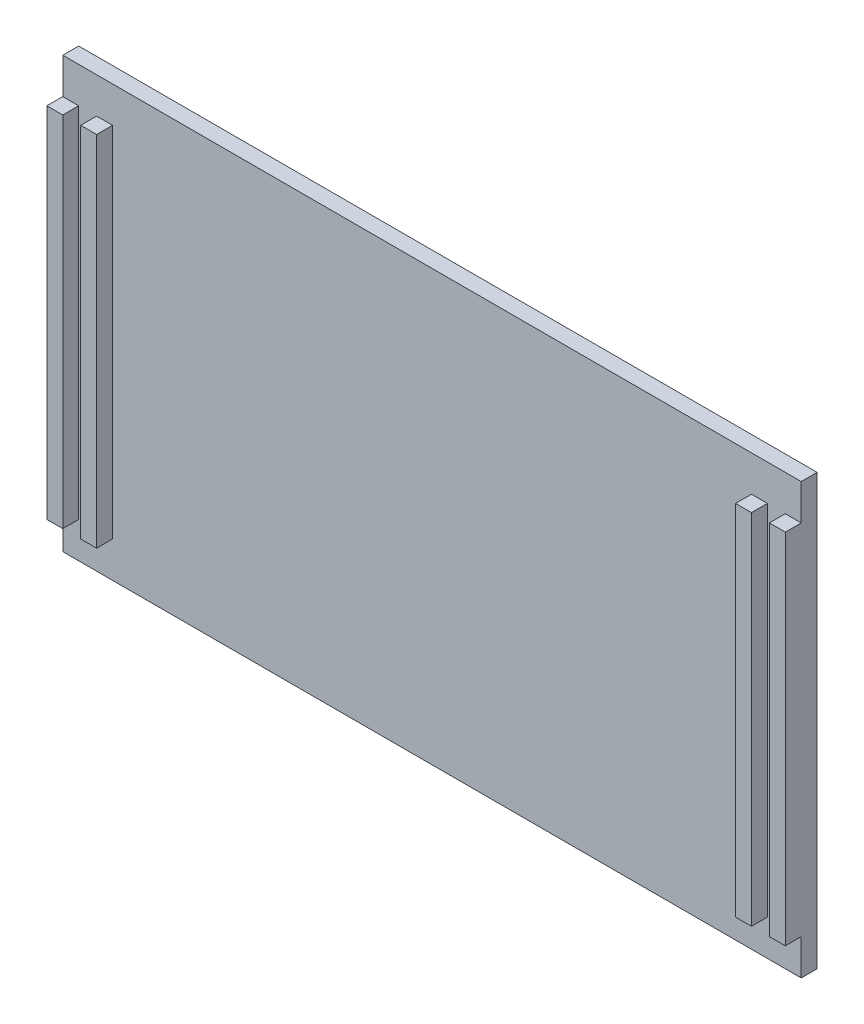
ISO-10303-21;
HEADER;
FILE_DESCRIPTION(('STEP AP214'),'2;1');
FILE_NAME('part.step','',(''),(''),'','','');
FILE_SCHEMA(('AUTOMOTIVE_DESIGN { 1 0 10303 214 1 1 1 1 }'));
ENDSEC;
DATA;
#1=APPLICATION_CONTEXT('core data for automotive mechanical design processes');
#2=APPLICATION_PROTOCOL_DEFINITION('international standard','automotive_design',2000,#1);
#3=PRODUCT_CONTEXT('',#1,'mechanical');
#4=PRODUCT('Part','Part','',(#3));
#5=PRODUCT_RELATED_PRODUCT_CATEGORY('part','',(#4));
#6=PRODUCT_DEFINITION_FORMATION('','',#4);
#7=PRODUCT_DEFINITION_CONTEXT('part definition',#1,'design');
#8=PRODUCT_DEFINITION('design','',#6,#7);
#9=PRODUCT_DEFINITION_SHAPE('','',#8);
#10=(LENGTH_UNIT() NAMED_UNIT(*) SI_UNIT(.MILLI.,.METRE.));
#11=(NAMED_UNIT(*) PLANE_ANGLE_UNIT() SI_UNIT($,.RADIAN.));
#12=(NAMED_UNIT(*) SI_UNIT($,.STERADIAN.) SOLID_ANGLE_UNIT());
#13=UNCERTAINTY_MEASURE_WITH_UNIT(LENGTH_MEASURE(1.E-05),#10,'distance_accuracy_value','');
#14=(GEOMETRIC_REPRESENTATION_CONTEXT(3) GLOBAL_UNCERTAINTY_ASSIGNED_CONTEXT((#13)) GLOBAL_UNIT_ASSIGNED_CONTEXT((#10,
#11,#12)) REPRESENTATION_CONTEXT('',''));
#15=CARTESIAN_POINT('',(0.,0.,0.));
#16=DIRECTION('',(0.,0.,1.));
#17=DIRECTION('',(1.,0.,0.));
#18=AXIS2_PLACEMENT_3D('',#15,#16,#17);
#19=CARTESIAN_POINT('',(-63.4088927024772,54.,-20.4879937354561));
#20=DIRECTION('',(1.,0.,0.));
#21=DIRECTION('',(0.,0.,-1.));
#22=AXIS2_PLACEMENT_3D('',#19,#20,#21);
#23=PLANE('',#22);
#24=DIRECTION('',(0.,0.,1.));
#25=VECTOR('',#24,1.);
#26=CARTESIAN_POINT('',(-63.4088927024772,-54.,-20.4879937354561));
#27=LINE('',#26,#25);
#28=CARTESIAN_POINT('',(-63.4088927024772,-54.,-20.4879937354561));
#29=VERTEX_POINT('',#28);
#30=CARTESIAN_POINT('',(-63.4088927024772,-54.,-16.4879937354562));
#31=VERTEX_POINT('',#30);
#32=EDGE_CURVE('E195',#29,#31,#27,.T.);
#33=ORIENTED_EDGE('',*,*,#32,.T.);
#34=DIRECTION('',(0.,-1.,0.));
#35=VECTOR('',#34,1.);
#36=CARTESIAN_POINT('',(-63.4088927024773,-54.,-16.4879937354561));
#37=LINE('',#36,#35);
#38=CARTESIAN_POINT('',(-63.4088927024773,-45.,-16.4879937354562));
#39=VERTEX_POINT('',#38);
#40=EDGE_CURVE('E175',#39,#31,#37,.T.);
#41=ORIENTED_EDGE('',*,*,#40,.F.);
#42=DIRECTION('',(0.,0.,1.));
#43=VECTOR('',#42,1.);
#44=CARTESIAN_POINT('',(-63.4088927024773,-45.,-202.206194243645));
#45=LINE('',#44,#43);
#46=CARTESIAN_POINT('',(-63.4088927024773,-45.,-12.4879937354561));
#47=VERTEX_POINT('',#46);
#48=EDGE_CURVE('E187',#39,#47,#45,.T.);
#49=ORIENTED_EDGE('',*,*,#48,.T.);
#50=DIRECTION('',(0.,-1.,0.));
#51=VECTOR('',#50,1.);
#52=CARTESIAN_POINT('',(-63.4088927024772,54.,-12.4879937354561));
#53=LINE('',#52,#51);
#54=CARTESIAN_POINT('',(-63.4088927024773,45.,-12.4879937354561));
#55=VERTEX_POINT('',#54);
#56=EDGE_CURVE('E11',#55,#47,#53,.T.);
#57=ORIENTED_EDGE('',*,*,#56,.F.);
#58=DIRECTION('',(0.,0.,1.));
#59=VECTOR('',#58,1.);
#60=CARTESIAN_POINT('',(-63.4088927024773,45.,-202.206194243645));
#61=LINE('',#60,#59);
#62=CARTESIAN_POINT('',(-63.4088927024773,45.,-16.4879937354561));
#63=VERTEX_POINT('',#62);
#64=EDGE_CURVE('E235',#63,#55,#61,.T.);
#65=ORIENTED_EDGE('',*,*,#64,.F.);
#66=DIRECTION('',(0.,-1.,0.));
#67=VECTOR('',#66,1.);
#68=CARTESIAN_POINT('',(-63.4088927024773,54.,-16.4879937354561));
#69=LINE('',#68,#67);
#70=CARTESIAN_POINT('',(-63.4088927024773,54.,-16.4879937354562));
#71=VERTEX_POINT('',#70);
#72=EDGE_CURVE('E223',#71,#63,#69,.T.);
#73=ORIENTED_EDGE('',*,*,#72,.F.);
#74=DIRECTION('',(0.,0.,1.));
#75=VECTOR('',#74,1.);
#76=CARTESIAN_POINT('',(-63.4088927024772,54.,-20.4879937354561));
#77=LINE('',#76,#75);
#78=CARTESIAN_POINT('',(-63.4088927024772,54.,-20.4879937354561));
#79=VERTEX_POINT('',#78);
#80=EDGE_CURVE('E256',#79,#71,#77,.T.);
#81=ORIENTED_EDGE('',*,*,#80,.F.);
#82=DIRECTION('',(0.,-1.,0.));
#83=VECTOR('',#82,1.);
#84=CARTESIAN_POINT('',(-63.4088927024772,54.,-20.4879937354561));
#85=LINE('',#84,#83);
#86=EDGE_CURVE('E264',#79,#29,#85,.T.);
#87=ORIENTED_EDGE('',*,*,#86,.T.);
#88=EDGE_LOOP('',(#33,#41,#49,#57,#65,#73,#81,#87));
#89=FACE_BOUND('',#88,.T.);
#90=ADVANCED_FACE('F35',(#89),#23,.F.);
#91=CARTESIAN_POINT('',(-63.4088927024772,54.,-12.4879937354561));
#92=DIRECTION('',(0.,0.,-1.));
#93=DIRECTION('',(-1.,0.,0.));
#94=AXIS2_PLACEMENT_3D('',#91,#92,#93);
#95=PLANE('',#94);
#96=ORIENTED_EDGE('',*,*,#56,.T.);
#97=DIRECTION('',(-1.,0.,0.));
#98=VECTOR('',#97,1.);
#99=CARTESIAN_POINT('',(122.091107297523,-45.,-12.4879937354561));
#100=LINE('',#99,#98);
#101=CARTESIAN_POINT('',(-59.4088927024772,-45.,-12.4879937354561));
#102=VERTEX_POINT('',#101);
#103=EDGE_CURVE('E190',#102,#47,#100,.T.);
#104=ORIENTED_EDGE('',*,*,#103,.F.);
#105=DIRECTION('',(0.,-1.,0.));
#106=VECTOR('',#105,1.);
#107=CARTESIAN_POINT('',(-59.4088927024772,54.,-12.4879937354561));
#108=LINE('',#107,#106);
#109=CARTESIAN_POINT('',(-59.4088927024772,45.,-12.4879937354561));
#110=VERTEX_POINT('',#109);
#111=EDGE_CURVE('E42',#110,#102,#108,.T.);
#112=ORIENTED_EDGE('',*,*,#111,.F.);
#113=DIRECTION('',(1.,0.,0.));
#114=VECTOR('',#113,1.);
#115=CARTESIAN_POINT('',(122.091107297523,45.,-12.4879937354561));
#116=LINE('',#115,#114);
#117=EDGE_CURVE('E221',#55,#110,#116,.T.);
#118=ORIENTED_EDGE('',*,*,#117,.F.);
#119=EDGE_LOOP('',(#96,#104,#112,#118));
#120=FACE_BOUND('',#119,.T.);
#121=ADVANCED_FACE('F313',(#120),#95,.F.);
#122=CARTESIAN_POINT('',(-59.4088927024772,54.,-12.4879937354561));
#123=DIRECTION('',(-1.,0.,0.));
#124=DIRECTION('',(0.,0.,1.));
#125=AXIS2_PLACEMENT_3D('',#122,#123,#124);
#126=PLANE('',#125);
#127=ORIENTED_EDGE('',*,*,#111,.T.);
#128=DIRECTION('',(0.,0.,-1.));
#129=VECTOR('',#128,1.);
#130=CARTESIAN_POINT('',(-59.4088927024772,-45.,-12.4879937354561));
#131=LINE('',#130,#129);
#132=CARTESIAN_POINT('',(-59.4088927024772,-45.,-16.4879937354561));
#133=VERTEX_POINT('',#132);
#134=EDGE_CURVE('E218',#102,#133,#131,.T.);
#135=ORIENTED_EDGE('',*,*,#134,.T.);
#136=DIRECTION('',(0.,-1.,0.));
#137=VECTOR('',#136,1.);
#138=CARTESIAN_POINT('',(-59.4088927024772,54.,-16.4879937354561));
#139=LINE('',#138,#137);
#140=CARTESIAN_POINT('',(-59.4088927024772,45.,-16.4879937354561));
#141=VERTEX_POINT('',#140);
#142=EDGE_CURVE('E179',#141,#133,#139,.T.);
#143=ORIENTED_EDGE('',*,*,#142,.F.);
#144=DIRECTION('',(0.,0.,1.));
#145=VECTOR('',#144,1.);
#146=CARTESIAN_POINT('',(-59.4088927024772,45.,-12.4879937354561));
#147=LINE('',#146,#145);
#148=EDGE_CURVE('E253',#141,#110,#147,.T.);
#149=ORIENTED_EDGE('',*,*,#148,.T.);
#150=EDGE_LOOP('',(#127,#135,#143,#149));
#151=FACE_BOUND('',#150,.T.);
#152=ADVANCED_FACE('F310',(#151),#126,.F.);
#153=CARTESIAN_POINT('',(-54.9088927024772,54.,-16.4879937354561));
#154=DIRECTION('',(1.,0.,0.));
#155=DIRECTION('',(0.,0.,-1.));
#156=AXIS2_PLACEMENT_3D('',#153,#154,#155);
#157=PLANE('',#156);
#158=DIRECTION('',(0.,-1.,0.));
#159=VECTOR('',#158,1.);
#160=CARTESIAN_POINT('',(-54.9088927024772,54.,-16.4879937354561));
#161=LINE('',#160,#159);
#162=CARTESIAN_POINT('',(-54.9088927024772,45.,-16.4879937354561));
#163=VERTEX_POINT('',#162);
#164=CARTESIAN_POINT('',(-54.9088927024772,-45.,-16.4879937354561));
#165=VERTEX_POINT('',#164);
#166=EDGE_CURVE('E304',#163,#165,#161,.T.);
#167=ORIENTED_EDGE('',*,*,#166,.T.);
#168=DIRECTION('',(0.,0.,1.));
#169=VECTOR('',#168,1.);
#170=CARTESIAN_POINT('',(-54.9088927024772,-45.,-16.4879937354561));
#171=LINE('',#170,#169);
#172=CARTESIAN_POINT('',(-54.9088927024772,-45.,-12.4879937354561));
#173=VERTEX_POINT('',#172);
#174=EDGE_CURVE('E215',#165,#173,#171,.T.);
#175=ORIENTED_EDGE('',*,*,#174,.T.);
#176=DIRECTION('',(0.,-1.,0.));
#177=VECTOR('',#176,1.);
#178=CARTESIAN_POINT('',(-54.9088927024772,54.,-12.4879937354561));
#179=LINE('',#178,#177);
#180=CARTESIAN_POINT('',(-54.9088927024772,45.,-12.4879937354561));
#181=VERTEX_POINT('',#180);
#182=EDGE_CURVE('E301',#181,#173,#179,.T.);
#183=ORIENTED_EDGE('',*,*,#182,.F.);
#184=DIRECTION('',(0.,0.,-1.));
#185=VECTOR('',#184,1.);
#186=CARTESIAN_POINT('',(-54.9088927024772,45.,-16.4879937354561));
#187=LINE('',#186,#185);
#188=EDGE_CURVE('E250',#181,#163,#187,.T.);
#189=ORIENTED_EDGE('',*,*,#188,.T.);
#190=EDGE_LOOP('',(#167,#175,#183,#189));
#191=FACE_BOUND('',#190,.T.);
#192=ADVANCED_FACE('F361',(#191),#157,.F.);
#193=CARTESIAN_POINT('',(-54.9088927024772,54.,-12.4879937354561));
#194=DIRECTION('',(0.,0.,-1.));
#195=DIRECTION('',(-1.,0.,0.));
#196=AXIS2_PLACEMENT_3D('',#193,#194,#195);
#197=PLANE('',#196);
#198=ORIENTED_EDGE('',*,*,#182,.T.);
#199=CARTESIAN_POINT('',(-50.9088927024772,-45.,-12.4879937354561));
#200=VERTEX_POINT('',#199);
#201=EDGE_CURVE('E314',#200,#173,#100,.T.);
#202=ORIENTED_EDGE('',*,*,#201,.F.);
#203=DIRECTION('',(0.,-1.,0.));
#204=VECTOR('',#203,1.);
#205=CARTESIAN_POINT('',(-50.9088927024772,54.,-12.4879937354561));
#206=LINE('',#205,#204);
#207=CARTESIAN_POINT('',(-50.9088927024772,45.,-12.4879937354561));
#208=VERTEX_POINT('',#207);
#209=EDGE_CURVE('E298',#208,#200,#206,.T.);
#210=ORIENTED_EDGE('',*,*,#209,.F.);
#211=EDGE_CURVE('E224',#181,#208,#116,.T.);
#212=ORIENTED_EDGE('',*,*,#211,.F.);
#213=EDGE_LOOP('',(#198,#202,#210,#212));
#214=FACE_BOUND('',#213,.T.);
#215=ADVANCED_FACE('F368',(#214),#197,.F.);
#216=CARTESIAN_POINT('',(-50.9088927024772,54.,-12.4879937354561));
#217=DIRECTION('',(-1.,0.,0.));
#218=DIRECTION('',(0.,0.,1.));
#219=AXIS2_PLACEMENT_3D('',#216,#217,#218);
#220=PLANE('',#219);
#221=ORIENTED_EDGE('',*,*,#209,.T.);
#222=DIRECTION('',(0.,0.,-1.));
#223=VECTOR('',#222,1.);
#224=CARTESIAN_POINT('',(-50.9088927024772,-45.,-12.4879937354561));
#225=LINE('',#224,#223);
#226=CARTESIAN_POINT('',(-50.9088927024772,-45.,-16.4879937354561));
#227=VERTEX_POINT('',#226);
#228=EDGE_CURVE('E212',#200,#227,#225,.T.);
#229=ORIENTED_EDGE('',*,*,#228,.T.);
#230=DIRECTION('',(0.,-1.,0.));
#231=VECTOR('',#230,1.);
#232=CARTESIAN_POINT('',(-50.9088927024772,54.,-16.4879937354561));
#233=LINE('',#232,#231);
#234=CARTESIAN_POINT('',(-50.9088927024772,45.,-16.4879937354561));
#235=VERTEX_POINT('',#234);
#236=EDGE_CURVE('E295',#235,#227,#233,.T.);
#237=ORIENTED_EDGE('',*,*,#236,.F.);
#238=DIRECTION('',(0.,0.,1.));
#239=VECTOR('',#238,1.);
#240=CARTESIAN_POINT('',(-50.9088927024772,45.,-12.4879937354561));
#241=LINE('',#240,#239);
#242=EDGE_CURVE('E247',#235,#208,#241,.T.);
#243=ORIENTED_EDGE('',*,*,#242,.T.);
#244=EDGE_LOOP('',(#221,#229,#237,#243));
#245=FACE_BOUND('',#244,.T.);
#246=ADVANCED_FACE('F371',(#245),#220,.F.);
#247=CARTESIAN_POINT('',(109.591107297523,54.,-12.4879937354561));
#248=DIRECTION('',(1.,0.,0.));
#249=DIRECTION('',(0.,0.,-1.));
#250=AXIS2_PLACEMENT_3D('',#247,#248,#249);
#251=PLANE('',#250);
#252=DIRECTION('',(0.,-1.,0.));
#253=VECTOR('',#252,1.);
#254=CARTESIAN_POINT('',(109.591107297523,54.,-16.4879937354561));
#255=LINE('',#254,#253);
#256=CARTESIAN_POINT('',(109.591107297523,45.,-16.4879937354561));
#257=VERTEX_POINT('',#256);
#258=CARTESIAN_POINT('',(109.591107297523,-45.,-16.4879937354561));
#259=VERTEX_POINT('',#258);
#260=EDGE_CURVE('E292',#257,#259,#255,.T.);
#261=ORIENTED_EDGE('',*,*,#260,.T.);
#262=DIRECTION('',(0.,0.,1.));
#263=VECTOR('',#262,1.);
#264=CARTESIAN_POINT('',(109.591107297523,-45.,-12.4879937354561));
#265=LINE('',#264,#263);
#266=CARTESIAN_POINT('',(109.591107297523,-45.,-12.4879937354561));
#267=VERTEX_POINT('',#266);
#268=EDGE_CURVE('E209',#259,#267,#265,.T.);
#269=ORIENTED_EDGE('',*,*,#268,.T.);
#270=DIRECTION('',(0.,-1.,0.));
#271=VECTOR('',#270,1.);
#272=CARTESIAN_POINT('',(109.591107297523,54.,-12.4879937354561));
#273=LINE('',#272,#271);
#274=CARTESIAN_POINT('',(109.591107297523,45.,-12.4879937354561));
#275=VERTEX_POINT('',#274);
#276=EDGE_CURVE('E289',#275,#267,#273,.T.);
#277=ORIENTED_EDGE('',*,*,#276,.F.);
#278=DIRECTION('',(0.,0.,-1.));
#279=VECTOR('',#278,1.);
#280=CARTESIAN_POINT('',(109.591107297523,45.,-12.4879937354561));
#281=LINE('',#280,#279);
#282=EDGE_CURVE('E244',#275,#257,#281,.T.);
#283=ORIENTED_EDGE('',*,*,#282,.T.);
#284=EDGE_LOOP('',(#261,#269,#277,#283));
#285=FACE_BOUND('',#284,.T.);
#286=ADVANCED_FACE('F327',(#285),#251,.F.);
#287=CARTESIAN_POINT('',(113.591107297523,54.,-12.4879937354561));
#288=DIRECTION('',(0.,0.,-1.));
#289=DIRECTION('',(-1.,0.,0.));
#290=AXIS2_PLACEMENT_3D('',#287,#288,#289);
#291=PLANE('',#290);
#292=ORIENTED_EDGE('',*,*,#276,.T.);
#293=CARTESIAN_POINT('',(113.591107297523,-45.,-12.4879937354561));
#294=VERTEX_POINT('',#293);
#295=EDGE_CURVE('E316',#294,#267,#100,.T.);
#296=ORIENTED_EDGE('',*,*,#295,.F.);
#297=DIRECTION('',(0.,-1.,0.));
#298=VECTOR('',#297,1.);
#299=CARTESIAN_POINT('',(113.591107297523,54.,-12.4879937354561));
#300=LINE('',#299,#298);
#301=CARTESIAN_POINT('',(113.591107297523,45.,-12.4879937354561));
#302=VERTEX_POINT('',#301);
#303=EDGE_CURVE('E286',#302,#294,#300,.T.);
#304=ORIENTED_EDGE('',*,*,#303,.F.);
#305=EDGE_CURVE('E331',#275,#302,#116,.T.);
#306=ORIENTED_EDGE('',*,*,#305,.F.);
#307=EDGE_LOOP('',(#292,#296,#304,#306));
#308=FACE_BOUND('',#307,.T.);
#309=ADVANCED_FACE('F330',(#308),#291,.F.);
#310=CARTESIAN_POINT('',(113.591107297523,54.,-16.4879937354561));
#311=DIRECTION('',(-1.,0.,0.));
#312=DIRECTION('',(0.,0.,1.));
#313=AXIS2_PLACEMENT_3D('',#310,#311,#312);
#314=PLANE('',#313);
#315=ORIENTED_EDGE('',*,*,#303,.T.);
#316=DIRECTION('',(0.,0.,-1.));
#317=VECTOR('',#316,1.);
#318=CARTESIAN_POINT('',(113.591107297523,-45.,-16.4879937354561));
#319=LINE('',#318,#317);
#320=CARTESIAN_POINT('',(113.591107297523,-45.,-16.4879937354561));
#321=VERTEX_POINT('',#320);
#322=EDGE_CURVE('E206',#294,#321,#319,.T.);
#323=ORIENTED_EDGE('',*,*,#322,.T.);
#324=DIRECTION('',(0.,-1.,0.));
#325=VECTOR('',#324,1.);
#326=CARTESIAN_POINT('',(113.591107297523,54.,-16.4879937354561));
#327=LINE('',#326,#325);
#328=CARTESIAN_POINT('',(113.591107297523,45.,-16.4879937354561));
#329=VERTEX_POINT('',#328);
#330=EDGE_CURVE('E283',#329,#321,#327,.T.);
#331=ORIENTED_EDGE('',*,*,#330,.F.);
#332=DIRECTION('',(0.,0.,1.));
#333=VECTOR('',#332,1.);
#334=CARTESIAN_POINT('',(113.591107297523,45.,-16.4879937354561));
#335=LINE('',#334,#333);
#336=EDGE_CURVE('E241',#329,#302,#335,.T.);
#337=ORIENTED_EDGE('',*,*,#336,.T.);
#338=EDGE_LOOP('',(#315,#323,#331,#337));
#339=FACE_BOUND('',#338,.T.);
#340=ADVANCED_FACE('F418',(#339),#314,.F.);
#341=CARTESIAN_POINT('',(118.091107297523,54.,-16.4879937354561));
#342=DIRECTION('',(0.,0.,-1.));
#343=DIRECTION('',(-1.,0.,0.));
#344=AXIS2_PLACEMENT_3D('',#341,#342,#343);
#345=PLANE('',#344);
#346=DIRECTION('',(-1.,0.,0.));
#347=VECTOR('',#346,1.);
#348=CARTESIAN_POINT('',(122.091107297523,-45.,-16.4879937354561));
#349=LINE('',#348,#347);
#350=EDGE_CURVE('E182',#227,#165,#349,.T.);
#351=ORIENTED_EDGE('',*,*,#350,.T.);
#352=ORIENTED_EDGE('',*,*,#166,.F.);
#353=DIRECTION('',(1.,0.,0.));
#354=VECTOR('',#353,1.);
#355=CARTESIAN_POINT('',(122.091107297523,45.,-16.4879937354561));
#356=LINE('',#355,#354);
#357=EDGE_CURVE('E231',#163,#235,#356,.T.);
#358=ORIENTED_EDGE('',*,*,#357,.T.);
#359=ORIENTED_EDGE('',*,*,#236,.T.);
#360=EDGE_LOOP('',(#351,#352,#358,#359));
#361=FACE_BOUND('',#360,.T.);
#362=EDGE_CURVE('E352',#321,#259,#349,.T.);
#363=ORIENTED_EDGE('',*,*,#362,.T.);
#364=ORIENTED_EDGE('',*,*,#260,.F.);
#365=EDGE_CURVE('E372',#257,#329,#356,.T.);
#366=ORIENTED_EDGE('',*,*,#365,.T.);
#367=ORIENTED_EDGE('',*,*,#330,.T.);
#368=EDGE_LOOP('',(#363,#364,#366,#367));
#369=FACE_BOUND('',#368,.T.);
#370=ORIENTED_EDGE('',*,*,#142,.T.);
#371=EDGE_CURVE('E171',#133,#39,#349,.T.);
#372=ORIENTED_EDGE('',*,*,#371,.T.);
#373=ORIENTED_EDGE('',*,*,#40,.T.);
#374=DIRECTION('',(1.,0.,0.));
#375=VECTOR('',#374,1.);
#376=CARTESIAN_POINT('',(118.091107297523,-54.,-16.4879937354561));
#377=LINE('',#376,#375);
#378=CARTESIAN_POINT('',(122.091107297523,-54.,-16.4879937354561));
#379=VERTEX_POINT('',#378);
#380=EDGE_CURVE('E49',#31,#379,#377,.T.);
#381=ORIENTED_EDGE('',*,*,#380,.T.);
#382=DIRECTION('',(0.,1.,0.));
#383=VECTOR('',#382,1.);
#384=CARTESIAN_POINT('',(122.091107297523,-54.,-16.4879937354561));
#385=LINE('',#384,#383);
#386=CARTESIAN_POINT('',(122.091107297523,-45.,-16.4879937354561));
#387=VERTEX_POINT('',#386);
#388=EDGE_CURVE('E196',#379,#387,#385,.T.);
#389=ORIENTED_EDGE('',*,*,#388,.T.);
#390=CARTESIAN_POINT('',(118.091107297523,-45.,-16.4879937354561));
#391=VERTEX_POINT('',#390);
#392=EDGE_CURVE('E185',#387,#391,#349,.T.);
#393=ORIENTED_EDGE('',*,*,#392,.T.);
#394=DIRECTION('',(0.,-1.,0.));
#395=VECTOR('',#394,1.);
#396=CARTESIAN_POINT('',(118.091107297523,54.,-16.4879937354561));
#397=LINE('',#396,#395);
#398=CARTESIAN_POINT('',(118.091107297523,45.,-16.4879937354561));
#399=VERTEX_POINT('',#398);
#400=EDGE_CURVE('E280',#399,#391,#397,.T.);
#401=ORIENTED_EDGE('',*,*,#400,.F.);
#402=CARTESIAN_POINT('',(122.091107297523,45.,-16.4879937354561));
#403=VERTEX_POINT('',#402);
#404=EDGE_CURVE('E232',#399,#403,#356,.T.);
#405=ORIENTED_EDGE('',*,*,#404,.T.);
#406=DIRECTION('',(0.,1.,0.));
#407=VECTOR('',#406,1.);
#408=CARTESIAN_POINT('',(122.091107297523,54.,-16.4879937354561));
#409=LINE('',#408,#407);
#410=CARTESIAN_POINT('',(122.091107297523,54.,-16.4879937354562));
#411=VERTEX_POINT('',#410);
#412=EDGE_CURVE('E225',#403,#411,#409,.T.);
#413=ORIENTED_EDGE('',*,*,#412,.T.);
#414=DIRECTION('',(1.,0.,0.));
#415=VECTOR('',#414,1.);
#416=CARTESIAN_POINT('',(-59.4088927024772,54.,-16.4879937354561));
#417=LINE('',#416,#415);
#418=EDGE_CURVE('E57',#71,#411,#417,.T.);
#419=ORIENTED_EDGE('',*,*,#418,.F.);
#420=ORIENTED_EDGE('',*,*,#72,.T.);
#421=EDGE_CURVE('E229',#63,#141,#356,.T.);
#422=ORIENTED_EDGE('',*,*,#421,.T.);
#423=EDGE_LOOP('',(#370,#372,#373,#381,#389,#393,#401,#405,#413,#419,#420,#422));
#424=FACE_BOUND('',#423,.T.);
#425=ADVANCED_FACE('F173',(#361,#369,#424),#345,.F.);
#426=CARTESIAN_POINT('',(118.091107297523,54.,-12.4879937354561));
#427=DIRECTION('',(1.,0.,0.));
#428=DIRECTION('',(0.,0.,-1.));
#429=AXIS2_PLACEMENT_3D('',#426,#427,#428);
#430=PLANE('',#429);
#431=ORIENTED_EDGE('',*,*,#400,.T.);
#432=DIRECTION('',(0.,0.,1.));
#433=VECTOR('',#432,1.);
#434=CARTESIAN_POINT('',(118.091107297523,-45.,-12.4879937354561));
#435=LINE('',#434,#433);
#436=CARTESIAN_POINT('',(118.091107297523,-45.,-12.4879937354561));
#437=VERTEX_POINT('',#436);
#438=EDGE_CURVE('E203',#391,#437,#435,.T.);
#439=ORIENTED_EDGE('',*,*,#438,.T.);
#440=DIRECTION('',(0.,-1.,0.));
#441=VECTOR('',#440,1.);
#442=CARTESIAN_POINT('',(118.091107297523,54.,-12.4879937354561));
#443=LINE('',#442,#441);
#444=CARTESIAN_POINT('',(118.091107297523,45.,-12.4879937354561));
#445=VERTEX_POINT('',#444);
#446=EDGE_CURVE('E277',#445,#437,#443,.T.);
#447=ORIENTED_EDGE('',*,*,#446,.F.);
#448=DIRECTION('',(0.,0.,-1.));
#449=VECTOR('',#448,1.);
#450=CARTESIAN_POINT('',(118.091107297523,45.,-12.4879937354561));
#451=LINE('',#450,#449);
#452=EDGE_CURVE('E227',#445,#399,#451,.T.);
#453=ORIENTED_EDGE('',*,*,#452,.T.);
#454=EDGE_LOOP('',(#431,#439,#447,#453));
#455=FACE_BOUND('',#454,.T.);
#456=ADVANCED_FACE('F347',(#455),#430,.F.);
#457=CARTESIAN_POINT('',(122.091107297523,54.,-12.4879937354561));
#458=DIRECTION('',(0.,0.,-1.));
#459=DIRECTION('',(-1.,0.,0.));
#460=AXIS2_PLACEMENT_3D('',#457,#458,#459);
#461=PLANE('',#460);
#462=ORIENTED_EDGE('',*,*,#446,.T.);
#463=CARTESIAN_POINT('',(122.091107297523,-45.,-12.4879937354561));
#464=VERTEX_POINT('',#463);
#465=EDGE_CURVE('E183',#464,#437,#100,.T.);
#466=ORIENTED_EDGE('',*,*,#465,.F.);
#467=DIRECTION('',(0.,-1.,0.));
#468=VECTOR('',#467,1.);
#469=CARTESIAN_POINT('',(122.091107297523,54.,-12.4879937354561));
#470=LINE('',#469,#468);
#471=CARTESIAN_POINT('',(122.091107297523,45.,-12.4879937354561));
#472=VERTEX_POINT('',#471);
#473=EDGE_CURVE('E274',#472,#464,#470,.T.);
#474=ORIENTED_EDGE('',*,*,#473,.F.);
#475=EDGE_CURVE('E220',#445,#472,#116,.T.);
#476=ORIENTED_EDGE('',*,*,#475,.F.);
#477=EDGE_LOOP('',(#462,#466,#474,#476));
#478=FACE_BOUND('',#477,.T.);
#479=ADVANCED_FACE('F345',(#478),#461,.F.);
#480=CARTESIAN_POINT('',(122.091107297523,54.,-20.4879937354561));
#481=DIRECTION('',(-1.,0.,0.));
#482=DIRECTION('',(0.,0.,1.));
#483=AXIS2_PLACEMENT_3D('',#480,#481,#482);
#484=PLANE('',#483);
#485=DIRECTION('',(0.,0.,1.));
#486=VECTOR('',#485,1.);
#487=CARTESIAN_POINT('',(122.091107297523,-45.,-202.206194243645));
#488=LINE('',#487,#486);
#489=EDGE_CURVE('E199',#387,#464,#488,.T.);
#490=ORIENTED_EDGE('',*,*,#489,.F.);
#491=ORIENTED_EDGE('',*,*,#388,.F.);
#492=DIRECTION('',(0.,0.,-1.));
#493=VECTOR('',#492,1.);
#494=CARTESIAN_POINT('',(122.091107297523,-54.,-20.4879937354561));
#495=LINE('',#494,#493);
#496=CARTESIAN_POINT('',(122.091107297523,-54.,-20.4879937354561));
#497=VERTEX_POINT('',#496);
#498=EDGE_CURVE('E267',#379,#497,#495,.T.);
#499=ORIENTED_EDGE('',*,*,#498,.T.);
#500=DIRECTION('',(0.,-1.,0.));
#501=VECTOR('',#500,1.);
#502=CARTESIAN_POINT('',(122.091107297523,54.,-20.4879937354561));
#503=LINE('',#502,#501);
#504=CARTESIAN_POINT('',(122.091107297523,54.,-20.4879937354561));
#505=VERTEX_POINT('',#504);
#506=EDGE_CURVE('E271',#505,#497,#503,.T.);
#507=ORIENTED_EDGE('',*,*,#506,.F.);
#508=DIRECTION('',(0.,0.,-1.));
#509=VECTOR('',#508,1.);
#510=CARTESIAN_POINT('',(122.091107297523,54.,-20.4879937354561));
#511=LINE('',#510,#509);
#512=EDGE_CURVE('E260',#411,#505,#511,.T.);
#513=ORIENTED_EDGE('',*,*,#512,.F.);
#514=ORIENTED_EDGE('',*,*,#412,.F.);
#515=DIRECTION('',(0.,0.,1.));
#516=VECTOR('',#515,1.);
#517=CARTESIAN_POINT('',(122.091107297523,45.,-202.206194243645));
#518=LINE('',#517,#516);
#519=EDGE_CURVE('E228',#403,#472,#518,.T.);
#520=ORIENTED_EDGE('',*,*,#519,.T.);
#521=ORIENTED_EDGE('',*,*,#473,.T.);
#522=EDGE_LOOP('',(#490,#491,#499,#507,#513,#514,#520,#521));
#523=FACE_BOUND('',#522,.T.);
#524=ADVANCED_FACE('F343',(#523),#484,.F.);
#525=CARTESIAN_POINT('',(-63.4088927024772,54.,-20.4879937354561));
#526=DIRECTION('',(0.,0.,1.));
#527=DIRECTION('',(1.,0.,0.));
#528=AXIS2_PLACEMENT_3D('',#525,#526,#527);
#529=PLANE('',#528);
#530=DIRECTION('',(-1.,0.,0.));
#531=VECTOR('',#530,1.);
#532=CARTESIAN_POINT('',(-63.4088927024772,-54.,-20.4879937354561));
#533=LINE('',#532,#531);
#534=EDGE_CURVE('E258',#497,#29,#533,.T.);
#535=ORIENTED_EDGE('',*,*,#534,.T.);
#536=ORIENTED_EDGE('',*,*,#86,.F.);
#537=DIRECTION('',(-1.,0.,0.));
#538=VECTOR('',#537,1.);
#539=CARTESIAN_POINT('',(-63.4088927024772,54.,-20.4879937354561));
#540=LINE('',#539,#538);
#541=EDGE_CURVE('E262',#505,#79,#540,.T.);
#542=ORIENTED_EDGE('',*,*,#541,.F.);
#543=ORIENTED_EDGE('',*,*,#506,.T.);
#544=EDGE_LOOP('',(#535,#536,#542,#543));
#545=FACE_BOUND('',#544,.T.);
#546=ADVANCED_FACE('F382',(#545),#529,.F.);
#547=CARTESIAN_POINT('',(0.,54.,0.));
#548=DIRECTION('',(0.,1.,0.));
#549=DIRECTION('',(0.,0.,1.));
#550=AXIS2_PLACEMENT_3D('',#547,#548,#549);
#551=PLANE('',#550);
#552=ORIENTED_EDGE('',*,*,#418,.T.);
#553=ORIENTED_EDGE('',*,*,#512,.T.);
#554=ORIENTED_EDGE('',*,*,#541,.T.);
#555=ORIENTED_EDGE('',*,*,#80,.T.);
#556=EDGE_LOOP('',(#552,#553,#554,#555));
#557=FACE_BOUND('',#556,.T.);
#558=ADVANCED_FACE('F378',(#557),#551,.T.);
#559=CARTESIAN_POINT('',(0.,-54.,0.));
#560=DIRECTION('',(0.,1.,0.));
#561=DIRECTION('',(0.,0.,1.));
#562=AXIS2_PLACEMENT_3D('',#559,#560,#561);
#563=PLANE('',#562);
#564=ORIENTED_EDGE('',*,*,#498,.F.);
#565=ORIENTED_EDGE('',*,*,#380,.F.);
#566=ORIENTED_EDGE('',*,*,#32,.F.);
#567=ORIENTED_EDGE('',*,*,#534,.F.);
#568=EDGE_LOOP('',(#564,#565,#566,#567));
#569=FACE_BOUND('',#568,.T.);
#570=ADVANCED_FACE('F388',(#569),#563,.F.);
#571=CARTESIAN_POINT('',(122.091107297523,45.,-202.206194243645));
#572=DIRECTION('',(0.,-1.,0.));
#573=DIRECTION('',(1.,0.,0.));
#574=AXIS2_PLACEMENT_3D('',#571,#572,#573);
#575=PLANE('',#574);
#576=ORIENTED_EDGE('',*,*,#421,.F.);
#577=ORIENTED_EDGE('',*,*,#64,.T.);
#578=ORIENTED_EDGE('',*,*,#117,.T.);
#579=ORIENTED_EDGE('',*,*,#148,.F.);
#580=EDGE_LOOP('',(#576,#577,#578,#579));
#581=FACE_BOUND('',#580,.T.);
#582=ADVANCED_FACE('F386',(#581),#575,.F.);
#583=ORIENTED_EDGE('',*,*,#211,.T.);
#584=ORIENTED_EDGE('',*,*,#242,.F.);
#585=ORIENTED_EDGE('',*,*,#357,.F.);
#586=ORIENTED_EDGE('',*,*,#188,.F.);
#587=EDGE_LOOP('',(#583,#584,#585,#586));
#588=FACE_BOUND('',#587,.T.);
#589=ADVANCED_FACE('F365',(#588),#575,.F.);
#590=ORIENTED_EDGE('',*,*,#305,.T.);
#591=ORIENTED_EDGE('',*,*,#336,.F.);
#592=ORIENTED_EDGE('',*,*,#365,.F.);
#593=ORIENTED_EDGE('',*,*,#282,.F.);
#594=EDGE_LOOP('',(#590,#591,#592,#593));
#595=FACE_BOUND('',#594,.T.);
#596=ADVANCED_FACE('F394',(#595),#575,.F.);
#597=ORIENTED_EDGE('',*,*,#475,.T.);
#598=ORIENTED_EDGE('',*,*,#519,.F.);
#599=ORIENTED_EDGE('',*,*,#404,.F.);
#600=ORIENTED_EDGE('',*,*,#452,.F.);
#601=EDGE_LOOP('',(#597,#598,#599,#600));
#602=FACE_BOUND('',#601,.T.);
#603=ADVANCED_FACE('F336',(#602),#575,.F.);
#604=CARTESIAN_POINT('',(122.091107297523,-45.,-202.206194243645));
#605=DIRECTION('',(0.,1.,0.));
#606=DIRECTION('',(-1.,0.,0.));
#607=AXIS2_PLACEMENT_3D('',#604,#605,#606);
#608=PLANE('',#607);
#609=ORIENTED_EDGE('',*,*,#103,.T.);
#610=ORIENTED_EDGE('',*,*,#48,.F.);
#611=ORIENTED_EDGE('',*,*,#371,.F.);
#612=ORIENTED_EDGE('',*,*,#134,.F.);
#613=EDGE_LOOP('',(#609,#610,#611,#612));
#614=FACE_BOUND('',#613,.T.);
#615=ADVANCED_FACE('F188',(#614),#608,.F.);
#616=ORIENTED_EDGE('',*,*,#350,.F.);
#617=ORIENTED_EDGE('',*,*,#228,.F.);
#618=ORIENTED_EDGE('',*,*,#201,.T.);
#619=ORIENTED_EDGE('',*,*,#174,.F.);
#620=EDGE_LOOP('',(#616,#617,#618,#619));
#621=FACE_BOUND('',#620,.T.);
#622=ADVANCED_FACE('F454',(#621),#608,.F.);
#623=ORIENTED_EDGE('',*,*,#362,.F.);
#624=ORIENTED_EDGE('',*,*,#322,.F.);
#625=ORIENTED_EDGE('',*,*,#295,.T.);
#626=ORIENTED_EDGE('',*,*,#268,.F.);
#627=EDGE_LOOP('',(#623,#624,#625,#626));
#628=FACE_BOUND('',#627,.T.);
#629=ADVANCED_FACE('F321',(#628),#608,.F.);
#630=ORIENTED_EDGE('',*,*,#392,.F.);
#631=ORIENTED_EDGE('',*,*,#489,.T.);
#632=ORIENTED_EDGE('',*,*,#465,.T.);
#633=ORIENTED_EDGE('',*,*,#438,.F.);
#634=EDGE_LOOP('',(#630,#631,#632,#633));
#635=FACE_BOUND('',#634,.T.);
#636=ADVANCED_FACE('F350',(#635),#608,.F.);
#637=CLOSED_SHELL('',(#90,#121,#152,#192,#215,#246,#286,#309,#340,#425,#456,#479,#524,#546,#558,
#570,#582,#589,#596,#603,#615,#622,#629,#636));
#638=MANIFOLD_SOLID_BREP('B2',#637);
#639=ADVANCED_BREP_SHAPE_REPRESENTATION('',(#18,#638),#14);
#640=SHAPE_DEFINITION_REPRESENTATION(#9,#639);
ENDSEC;
END-ISO-10303-21;
